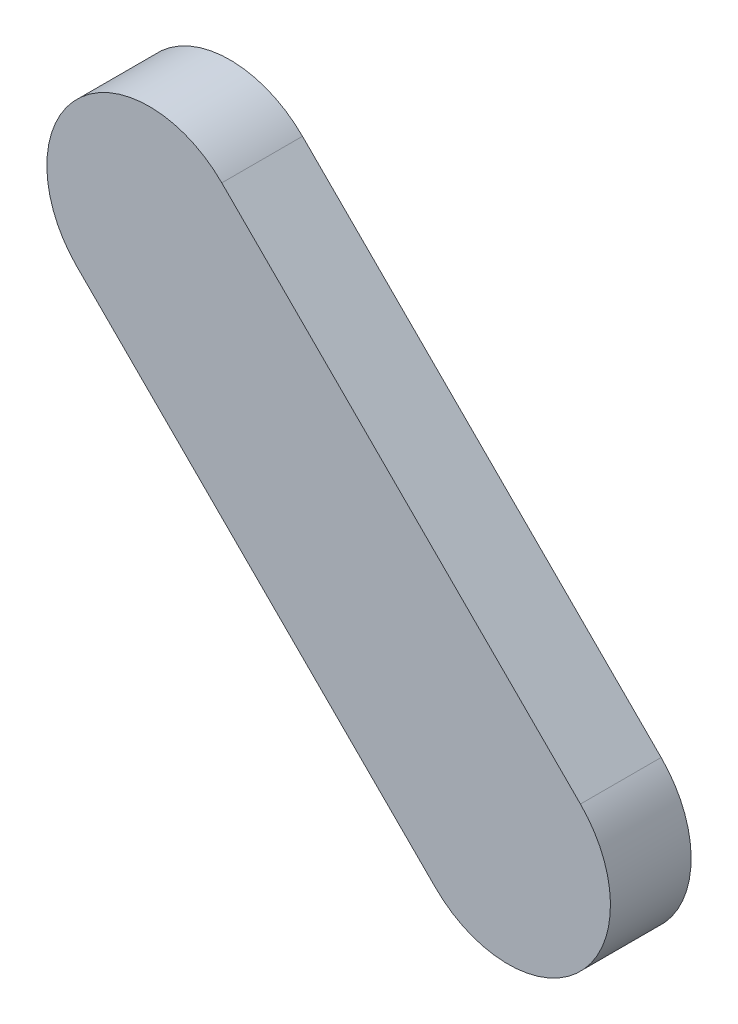
ISO-10303-21;
HEADER;
FILE_DESCRIPTION(('STEP AP214'),'2;1');
FILE_NAME('part.step','',(''),(''),'','','');
FILE_SCHEMA(('AUTOMOTIVE_DESIGN { 1 0 10303 214 1 1 1 1 }'));
ENDSEC;
DATA;
#1=APPLICATION_CONTEXT('core data for automotive mechanical design processes');
#2=APPLICATION_PROTOCOL_DEFINITION('international standard','automotive_design',2000,#1);
#3=PRODUCT_CONTEXT('',#1,'mechanical');
#4=PRODUCT('Part','Part','',(#3));
#5=PRODUCT_RELATED_PRODUCT_CATEGORY('part','',(#4));
#6=PRODUCT_DEFINITION_FORMATION('','',#4);
#7=PRODUCT_DEFINITION_CONTEXT('part definition',#1,'design');
#8=PRODUCT_DEFINITION('design','',#6,#7);
#9=PRODUCT_DEFINITION_SHAPE('','',#8);
#10=(LENGTH_UNIT() NAMED_UNIT(*) SI_UNIT(.MILLI.,.METRE.));
#11=(NAMED_UNIT(*) PLANE_ANGLE_UNIT() SI_UNIT($,.RADIAN.));
#12=(NAMED_UNIT(*) SI_UNIT($,.STERADIAN.) SOLID_ANGLE_UNIT());
#13=UNCERTAINTY_MEASURE_WITH_UNIT(LENGTH_MEASURE(1.E-05),#10,'distance_accuracy_value','');
#14=(GEOMETRIC_REPRESENTATION_CONTEXT(3) GLOBAL_UNCERTAINTY_ASSIGNED_CONTEXT((#13)) GLOBAL_UNIT_ASSIGNED_CONTEXT((#10,
#11,#12)) REPRESENTATION_CONTEXT('',''));
#15=CARTESIAN_POINT('',(0.,0.,0.));
#16=DIRECTION('',(0.,0.,1.));
#17=DIRECTION('',(1.,0.,0.));
#18=AXIS2_PLACEMENT_3D('',#15,#16,#17);
#19=CARTESIAN_POINT('',(87.1963966,64.97139406,0.));
#20=DIRECTION('',(0.707106781186548,0.707106781186548,0.));
#21=DIRECTION('',(0.707106781186548,-0.707106781186548,0.));
#22=AXIS2_PLACEMENT_3D('',#19,#20,#21);
#23=PLANE('',#22);
#24=DIRECTION('',(0.707106781186548,-0.707106781186548,0.));
#25=VECTOR('',#24,1.);
#26=CARTESIAN_POINT('',(87.1963966,64.97139406,0.1999996));
#27=LINE('',#26,#25);
#28=CARTESIAN_POINT('',(87.1963966,64.97139406,0.1999996));
#29=VERTEX_POINT('',#28);
#30=CARTESIAN_POINT('',(88.08539406,64.0823966,0.1999996));
#31=VERTEX_POINT('',#30);
#32=EDGE_CURVE('E11',#29,#31,#27,.T.);
#33=ORIENTED_EDGE('',*,*,#32,.F.);
#34=DIRECTION('',(0.,0.,1.));
#35=VECTOR('',#34,1.);
#36=CARTESIAN_POINT('',(87.1963966,64.97139406,0.));
#37=LINE('',#36,#35);
#38=CARTESIAN_POINT('',(87.1963966,64.97139406,0.));
#39=VERTEX_POINT('',#38);
#40=EDGE_CURVE('E24',#39,#29,#37,.T.);
#41=ORIENTED_EDGE('',*,*,#40,.F.);
#42=DIRECTION('',(0.707106781186548,-0.707106781186548,0.));
#43=VECTOR('',#42,1.);
#44=CARTESIAN_POINT('',(87.1963966,64.97139406,0.));
#45=LINE('',#44,#43);
#46=CARTESIAN_POINT('',(88.08539406,64.0823966,0.));
#47=VERTEX_POINT('',#46);
#48=EDGE_CURVE('E75',#39,#47,#45,.T.);
#49=ORIENTED_EDGE('',*,*,#48,.T.);
#50=DIRECTION('',(0.,0.,1.));
#51=VECTOR('',#50,1.);
#52=CARTESIAN_POINT('',(88.08539406,64.0823966,0.));
#53=LINE('',#52,#51);
#54=EDGE_CURVE('E37',#47,#31,#53,.T.);
#55=ORIENTED_EDGE('',*,*,#54,.T.);
#56=EDGE_LOOP('',(#33,#41,#49,#55));
#57=FACE_BOUND('',#56,.T.);
#58=ADVANCED_FACE('F17',(#57),#23,.F.);
#59=CARTESIAN_POINT('',(88.26499873,64.26200127,0.));
#60=DIRECTION('',(0.,0.,-1.));
#61=DIRECTION('',(-0.707106781186548,-0.707106781186548,0.));
#62=AXIS2_PLACEMENT_3D('',#59,#60,#61);
#63=CYLINDRICAL_SURFACE('',#62,0.253999360179549);
#64=CARTESIAN_POINT('',(88.26499873,64.26200127,0.1999996));
#65=DIRECTION('',(0.,0.,1.));
#66=DIRECTION('',(-0.707106781186548,-0.707106781186548,0.));
#67=AXIS2_PLACEMENT_3D('',#64,#65,#66);
#68=CIRCLE('',#67,0.253999360179549);
#69=CARTESIAN_POINT('',(88.4446034,64.44160594,0.1999996));
#70=VERTEX_POINT('',#69);
#71=EDGE_CURVE('E83',#31,#70,#68,.T.);
#72=ORIENTED_EDGE('',*,*,#71,.F.);
#73=ORIENTED_EDGE('',*,*,#54,.F.);
#74=CARTESIAN_POINT('',(88.26499873,64.26200127,0.));
#75=DIRECTION('',(0.,0.,1.));
#76=DIRECTION('',(-0.707106781186548,-0.707106781186548,0.));
#77=AXIS2_PLACEMENT_3D('',#74,#75,#76);
#78=CIRCLE('',#77,0.253999360179549);
#79=CARTESIAN_POINT('',(88.4446034,64.44160594,0.));
#80=VERTEX_POINT('',#79);
#81=EDGE_CURVE('E81',#47,#80,#78,.T.);
#82=ORIENTED_EDGE('',*,*,#81,.T.);
#83=DIRECTION('',(0.,0.,1.));
#84=VECTOR('',#83,1.);
#85=CARTESIAN_POINT('',(88.4446034,64.44160594,0.));
#86=LINE('',#85,#84);
#87=EDGE_CURVE('E67',#80,#70,#86,.T.);
#88=ORIENTED_EDGE('',*,*,#87,.T.);
#89=EDGE_LOOP('',(#72,#73,#82,#88));
#90=FACE_BOUND('',#89,.T.);
#91=ADVANCED_FACE('F89',(#90),#63,.T.);
#92=CARTESIAN_POINT('',(88.4446034,64.44160594,0.));
#93=DIRECTION('',(-0.707106781186542,-0.707106781186553,0.));
#94=DIRECTION('',(-0.707106781186553,0.707106781186542,0.));
#95=AXIS2_PLACEMENT_3D('',#92,#93,#94);
#96=PLANE('',#95);
#97=DIRECTION('',(-0.707106781186553,0.707106781186542,0.));
#98=VECTOR('',#97,1.);
#99=CARTESIAN_POINT('',(88.4446034,64.44160594,0.1999996));
#100=LINE('',#99,#98);
#101=CARTESIAN_POINT('',(87.55560594,65.3306034,0.1999996));
#102=VERTEX_POINT('',#101);
#103=EDGE_CURVE('E71',#70,#102,#100,.T.);
#104=ORIENTED_EDGE('',*,*,#103,.F.);
#105=ORIENTED_EDGE('',*,*,#87,.F.);
#106=DIRECTION('',(-0.707106781186553,0.707106781186542,0.));
#107=VECTOR('',#106,1.);
#108=CARTESIAN_POINT('',(88.4446034,64.44160594,0.));
#109=LINE('',#108,#107);
#110=CARTESIAN_POINT('',(87.55560594,65.3306034,0.));
#111=VERTEX_POINT('',#110);
#112=EDGE_CURVE('E63',#80,#111,#109,.T.);
#113=ORIENTED_EDGE('',*,*,#112,.T.);
#114=DIRECTION('',(0.,0.,1.));
#115=VECTOR('',#114,1.);
#116=CARTESIAN_POINT('',(87.55560594,65.3306034,0.));
#117=LINE('',#116,#115);
#118=EDGE_CURVE('E53',#111,#102,#117,.T.);
#119=ORIENTED_EDGE('',*,*,#118,.T.);
#120=EDGE_LOOP('',(#104,#105,#113,#119));
#121=FACE_BOUND('',#120,.T.);
#122=ADVANCED_FACE('F66',(#121),#96,.F.);
#123=CARTESIAN_POINT('',(87.37600127,65.15099873,0.));
#124=DIRECTION('',(0.,0.,-1.));
#125=DIRECTION('',(0.707106781186548,0.707106781186548,0.));
#126=AXIS2_PLACEMENT_3D('',#123,#124,#125);
#127=CYLINDRICAL_SURFACE('',#126,0.253999360179542);
#128=CARTESIAN_POINT('',(87.37600127,65.15099873,0.1999996));
#129=DIRECTION('',(0.,0.,1.));
#130=DIRECTION('',(0.707106781186548,0.707106781186548,0.));
#131=AXIS2_PLACEMENT_3D('',#128,#129,#130);
#132=CIRCLE('',#131,0.253999360179542);
#133=EDGE_CURVE('E59',#102,#29,#132,.T.);
#134=ORIENTED_EDGE('',*,*,#133,.F.);
#135=ORIENTED_EDGE('',*,*,#118,.F.);
#136=CARTESIAN_POINT('',(87.37600127,65.15099873,0.));
#137=DIRECTION('',(0.,0.,1.));
#138=DIRECTION('',(0.707106781186548,0.707106781186548,0.));
#139=AXIS2_PLACEMENT_3D('',#136,#137,#138);
#140=CIRCLE('',#139,0.253999360179542);
#141=EDGE_CURVE('E57',#111,#39,#140,.T.);
#142=ORIENTED_EDGE('',*,*,#141,.T.);
#143=ORIENTED_EDGE('',*,*,#40,.T.);
#144=EDGE_LOOP('',(#134,#135,#142,#143));
#145=FACE_BOUND('',#144,.T.);
#146=ADVANCED_FACE('F55',(#145),#127,.T.);
#147=CARTESIAN_POINT('',(87.1963966,64.97139406,0.));
#148=DIRECTION('',(0.,0.,-1.));
#149=DIRECTION('',(-1.,0.,0.));
#150=AXIS2_PLACEMENT_3D('',#147,#148,#149);
#151=PLANE('',#150);
#152=ORIENTED_EDGE('',*,*,#141,.F.);
#153=ORIENTED_EDGE('',*,*,#112,.F.);
#154=ORIENTED_EDGE('',*,*,#81,.F.);
#155=ORIENTED_EDGE('',*,*,#48,.F.);
#156=EDGE_LOOP('',(#152,#153,#154,#155));
#157=FACE_BOUND('',#156,.T.);
#158=ADVANCED_FACE('F74',(#157),#151,.T.);
#159=CARTESIAN_POINT('',(87.1963966,64.97139406,0.1999996));
#160=DIRECTION('',(0.,0.,-1.));
#161=DIRECTION('',(-1.,0.,0.));
#162=AXIS2_PLACEMENT_3D('',#159,#160,#161);
#163=PLANE('',#162);
#164=ORIENTED_EDGE('',*,*,#32,.T.);
#165=ORIENTED_EDGE('',*,*,#71,.T.);
#166=ORIENTED_EDGE('',*,*,#103,.T.);
#167=ORIENTED_EDGE('',*,*,#133,.T.);
#168=EDGE_LOOP('',(#164,#165,#166,#167));
#169=FACE_BOUND('',#168,.T.);
#170=ADVANCED_FACE('F91',(#169),#163,.F.);
#171=CLOSED_SHELL('',(#58,#91,#122,#146,#158,#170));
#172=MANIFOLD_SOLID_BREP('B1',#171);
#173=ADVANCED_BREP_SHAPE_REPRESENTATION('',(#18,#172),#14);
#174=SHAPE_DEFINITION_REPRESENTATION(#9,#173);
ENDSEC;
END-ISO-10303-21;
